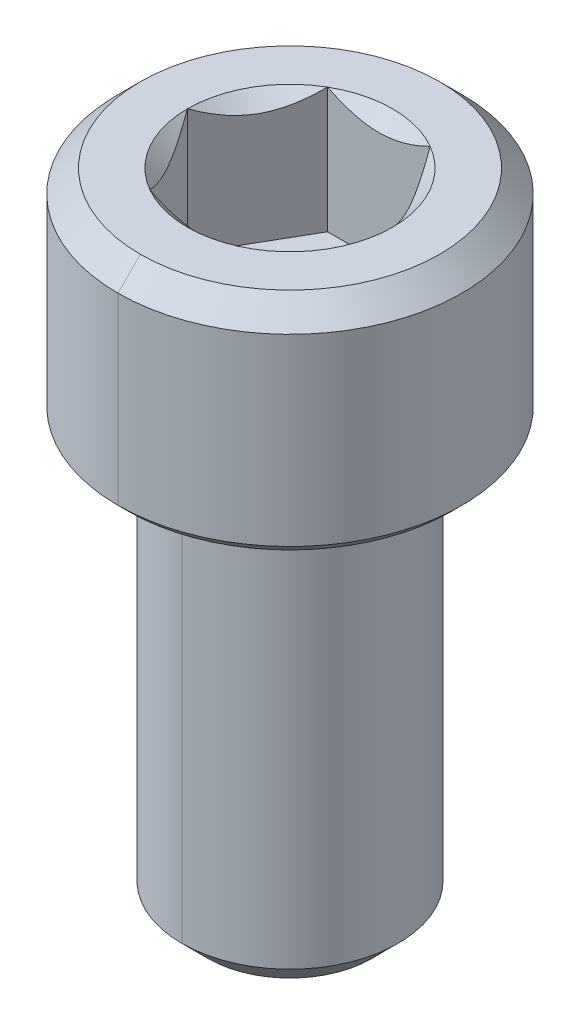
ISO-10303-21;
HEADER;
FILE_DESCRIPTION(('STEP AP214'),'2;1');
FILE_NAME('part.step','',(''),(''),'','','');
FILE_SCHEMA(('AUTOMOTIVE_DESIGN { 1 0 10303 214 1 1 1 1 }'));
ENDSEC;
DATA;
#1=APPLICATION_CONTEXT('core data for automotive mechanical design processes');
#2=APPLICATION_PROTOCOL_DEFINITION('international standard','automotive_design',2000,#1);
#3=PRODUCT_CONTEXT('',#1,'mechanical');
#4=PRODUCT('Part','Part','',(#3));
#5=PRODUCT_RELATED_PRODUCT_CATEGORY('part','',(#4));
#6=PRODUCT_DEFINITION_FORMATION('','',#4);
#7=PRODUCT_DEFINITION_CONTEXT('part definition',#1,'design');
#8=PRODUCT_DEFINITION('design','',#6,#7);
#9=PRODUCT_DEFINITION_SHAPE('','',#8);
#10=(LENGTH_UNIT() NAMED_UNIT(*) SI_UNIT(.MILLI.,.METRE.));
#11=(NAMED_UNIT(*) PLANE_ANGLE_UNIT() SI_UNIT($,.RADIAN.));
#12=(NAMED_UNIT(*) SI_UNIT($,.STERADIAN.) SOLID_ANGLE_UNIT());
#13=UNCERTAINTY_MEASURE_WITH_UNIT(LENGTH_MEASURE(1.E-05),#10,'distance_accuracy_value','');
#14=(GEOMETRIC_REPRESENTATION_CONTEXT(3) GLOBAL_UNCERTAINTY_ASSIGNED_CONTEXT((#13)) GLOBAL_UNIT_ASSIGNED_CONTEXT((#10,
#11,#12)) REPRESENTATION_CONTEXT('',''));
#15=CARTESIAN_POINT('',(0.,0.,0.));
#16=DIRECTION('',(0.,0.,1.));
#17=DIRECTION('',(1.,0.,0.));
#18=AXIS2_PLACEMENT_3D('',#15,#16,#17);
#19=CARTESIAN_POINT('',(0.,-0.1524,0.));
#20=DIRECTION('',(0.,1.,0.));
#21=DIRECTION('',(0.,0.,1.));
#22=AXIS2_PLACEMENT_3D('',#19,#20,#21);
#23=TOROIDAL_SURFACE('',#22,2.5654,0.1524);
#24=CARTESIAN_POINT('',(0.,-0.1524,-2.5654));
#25=DIRECTION('',(1.,0.,0.));
#26=DIRECTION('',(0.,0.,-1.));
#27=AXIS2_PLACEMENT_3D('',#24,#25,#26);
#28=CIRCLE('',#27,0.1524);
#29=CARTESIAN_POINT('',(0.,0.,-2.5654));
#30=VERTEX_POINT('',#29);
#31=CARTESIAN_POINT('',(0.,-0.1524,-2.413));
#32=VERTEX_POINT('',#31);
#33=EDGE_CURVE('E215',#30,#32,#28,.T.);
#34=ORIENTED_EDGE('',*,*,#33,.F.);
#35=CARTESIAN_POINT('',(0.,0.,0.));
#36=DIRECTION('',(0.,1.,0.));
#37=DIRECTION('',(0.,0.,1.));
#38=AXIS2_PLACEMENT_3D('',#35,#36,#37);
#39=CIRCLE('',#38,2.5654);
#40=CARTESIAN_POINT('',(0.,0.,2.5654));
#41=VERTEX_POINT('',#40);
#42=EDGE_CURVE('E428',#41,#30,#39,.T.);
#43=ORIENTED_EDGE('',*,*,#42,.F.);
#44=CARTESIAN_POINT('',(0.,-0.1524,2.5654));
#45=DIRECTION('',(-1.,0.,0.));
#46=DIRECTION('',(0.,0.,1.));
#47=AXIS2_PLACEMENT_3D('',#44,#45,#46);
#48=CIRCLE('',#47,0.1524);
#49=CARTESIAN_POINT('',(0.,-0.1524,2.413));
#50=VERTEX_POINT('',#49);
#51=EDGE_CURVE('E214',#41,#50,#48,.T.);
#52=ORIENTED_EDGE('',*,*,#51,.T.);
#53=CARTESIAN_POINT('',(0.,-0.1524,0.));
#54=DIRECTION('',(0.,-1.,0.));
#55=DIRECTION('',(0.,0.,1.));
#56=AXIS2_PLACEMENT_3D('',#53,#54,#55);
#57=CIRCLE('',#56,2.413);
#58=EDGE_CURVE('E185',#32,#50,#57,.T.);
#59=ORIENTED_EDGE('',*,*,#58,.F.);
#60=EDGE_LOOP('',(#34,#43,#52,#59));
#61=FACE_BOUND('',#60,.T.);
#62=ADVANCED_FACE('F16',(#61),#23,.F.);
#63=CARTESIAN_POINT('',(2.28769270663697,2.032,0.));
#64=DIRECTION('',(0.866025403784439,0.,-0.5));
#65=DIRECTION('',(0.,-1.,0.));
#66=AXIS2_PLACEMENT_3D('',#63,#64,#65);
#67=PLANE('',#66);
#68=DIRECTION('',(0.,1.,0.));
#69=VECTOR('',#68,1.);
#70=CARTESIAN_POINT('',(2.28769270663697,2.032,0.));
#71=LINE('',#70,#69);
#72=CARTESIAN_POINT('',(2.28769270663697,2.032,0.));
#73=VERTEX_POINT('',#72);
#74=CARTESIAN_POINT('',(2.28769270663697,4.826,0.));
#75=VERTEX_POINT('',#74);
#76=EDGE_CURVE('E11',#73,#75,#71,.T.);
#77=ORIENTED_EDGE('',*,*,#76,.T.);
#78=CARTESIAN_POINT('',(2.28769270663697,4.826,0.));
#79=CARTESIAN_POINT('',(2.14317957440595,4.68148686776898,-0.250304087385059));
#80=CARTESIAN_POINT('',(2.01227876614631,4.6063557329633,-0.477030938042588));
#81=CARTESIAN_POINT('',(1.86218187125153,4.52020691391333,-0.737006386058674));
#82=CARTESIAN_POINT('',(1.71787595811445,4.51951177250135,-0.986951559444716));
#83=CARTESIAN_POINT('',(1.5738329827954,4.51881789769698,-1.23644131117069));
#84=CARTESIAN_POINT('',(1.42308868167617,4.6041731544126,-1.49753809966066));
#85=CARTESIAN_POINT('',(1.29072619033411,4.67912016298365,-1.7267966596815));
#86=CARTESIAN_POINT('',(1.14384635331849,4.826,-1.9812));
#87=B_SPLINE_CURVE_WITH_KNOTS('',2,(#78,#79,#80,#81,#82,#83,#84,#85,#86),.UNSPECIFIED.,.F.,.F.,
(3,2,2,2,3),(0.,0.25,0.5,0.75,1.),.UNSPECIFIED.);
#88=CARTESIAN_POINT('',(1.14384635331849,4.826,-1.9812));
#89=VERTEX_POINT('',#88);
#90=EDGE_CURVE('E248',#75,#89,#87,.T.);
#91=ORIENTED_EDGE('',*,*,#90,.T.);
#92=DIRECTION('',(0.,1.,0.));
#93=VECTOR('',#92,1.);
#94=CARTESIAN_POINT('',(1.14384635331849,2.032,-1.9812));
#95=LINE('',#94,#93);
#96=CARTESIAN_POINT('',(1.14384635331849,2.032,-1.9812));
#97=VERTEX_POINT('',#96);
#98=EDGE_CURVE('E225',#97,#89,#95,.T.);
#99=ORIENTED_EDGE('',*,*,#98,.F.);
#100=DIRECTION('',(-0.5,0.,-0.866025403784439));
#101=VECTOR('',#100,1.);
#102=CARTESIAN_POINT('',(2.28769270663697,2.032,0.));
#103=LINE('',#102,#101);
#104=EDGE_CURVE('E212',#73,#97,#103,.T.);
#105=ORIENTED_EDGE('',*,*,#104,.F.);
#106=EDGE_LOOP('',(#77,#91,#99,#105));
#107=FACE_BOUND('',#106,.T.);
#108=ADVANCED_FACE('F255',(#107),#67,.F.);
#109=CARTESIAN_POINT('',(1.14384635331849,2.032,1.9812));
#110=DIRECTION('',(0.866025403784439,0.,0.5));
#111=DIRECTION('',(0.,-1.,0.));
#112=AXIS2_PLACEMENT_3D('',#109,#110,#111);
#113=PLANE('',#112);
#114=DIRECTION('',(0.,1.,0.));
#115=VECTOR('',#114,1.);
#116=CARTESIAN_POINT('',(1.14384635331849,2.032,1.9812));
#117=LINE('',#116,#115);
#118=CARTESIAN_POINT('',(1.14384635331849,2.032,1.9812));
#119=VERTEX_POINT('',#118);
#120=CARTESIAN_POINT('',(1.14384635331849,4.826,1.9812));
#121=VERTEX_POINT('',#120);
#122=EDGE_CURVE('E30',#119,#121,#117,.T.);
#123=ORIENTED_EDGE('',*,*,#122,.T.);
#124=CARTESIAN_POINT('',(1.14384635331849,4.826,1.9812));
#125=CARTESIAN_POINT('',(1.28835948554838,4.6814868677701,1.7308959126169));
#126=CARTESIAN_POINT('',(1.41926029380915,4.60635573296329,1.50416906195741));
#127=CARTESIAN_POINT('',(1.56935718870215,4.5202069139138,1.24419361394442));
#128=CARTESIAN_POINT('',(1.71366310184101,4.51951177250135,0.994248440555283));
#129=CARTESIAN_POINT('',(1.85770607715928,4.51881789769651,0.744758688830662));
#130=CARTESIAN_POINT('',(2.00845037827929,4.6041731544126,0.48366190033934));
#131=CARTESIAN_POINT('',(2.14081286962138,4.67912016298368,0.254403340318435));
#132=CARTESIAN_POINT('',(2.28769270663697,4.826,0.));
#133=B_SPLINE_CURVE_WITH_KNOTS('',2,(#124,#125,#126,#127,#128,#129,#130,#131,#132),
.UNSPECIFIED.,.F.,.F.,(3,2,2,2,3),(0.,0.25,0.5,0.75,1.),.UNSPECIFIED.);
#134=EDGE_CURVE('E321',#121,#75,#133,.T.);
#135=ORIENTED_EDGE('',*,*,#134,.T.);
#136=ORIENTED_EDGE('',*,*,#76,.F.);
#137=DIRECTION('',(0.5,0.,-0.866025403784439));
#138=VECTOR('',#137,1.);
#139=CARTESIAN_POINT('',(1.14384635331849,2.032,1.9812));
#140=LINE('',#139,#138);
#141=EDGE_CURVE('E222',#119,#73,#140,.T.);
#142=ORIENTED_EDGE('',*,*,#141,.F.);
#143=EDGE_LOOP('',(#123,#135,#136,#142));
#144=FACE_BOUND('',#143,.T.);
#145=ADVANCED_FACE('F265',(#144),#113,.F.);
#146=CARTESIAN_POINT('',(-1.14384635331848,2.032,1.9812));
#147=DIRECTION('',(0.,0.,1.));
#148=DIRECTION('',(1.,0.,0.));
#149=AXIS2_PLACEMENT_3D('',#146,#147,#148);
#150=PLANE('',#149);
#151=DIRECTION('',(0.,1.,0.));
#152=VECTOR('',#151,1.);
#153=CARTESIAN_POINT('',(-1.14384635331848,2.032,1.9812));
#154=LINE('',#153,#152);
#155=CARTESIAN_POINT('',(-1.14384635331848,2.032,1.9812));
#156=VERTEX_POINT('',#155);
#157=CARTESIAN_POINT('',(-1.14384635331848,4.826,1.9812));
#158=VERTEX_POINT('',#157);
#159=EDGE_CURVE('E572',#156,#158,#154,.T.);
#160=ORIENTED_EDGE('',*,*,#159,.T.);
#161=CARTESIAN_POINT('',(-1.14384635331848,4.826,1.9812));
#162=CARTESIAN_POINT('',(-0.852604529161856,4.68037908792168,1.9812));
#163=CARTESIAN_POINT('',(-0.58892975472875,4.6051869937822,1.9812));
#164=CARTESIAN_POINT('',(-0.288478278545423,4.51950729336303,1.9812));
#165=CARTESIAN_POINT('',(0.,4.51950729336303,1.9812));
#166=B_SPLINE_CURVE_WITH_KNOTS('',2,(#161,#162,#163,#164,#165),.UNSPECIFIED.,.F.,.F.,(3,2,3),
(0.,0.5,1.),.UNSPECIFIED.);
#167=CARTESIAN_POINT('',(0.,4.51950729336303,1.9812));
#168=VERTEX_POINT('',#167);
#169=EDGE_CURVE('E579',#158,#168,#166,.T.);
#170=ORIENTED_EDGE('',*,*,#169,.T.);
#171=CARTESIAN_POINT('',(0.,4.51950729336303,1.9812));
#172=CARTESIAN_POINT('',(0.287946815411568,4.51950729336303,1.9812));
#173=CARTESIAN_POINT('',(0.588849780232636,4.60516420753973,1.9812));
#174=CARTESIAN_POINT('',(0.851987770474281,4.68007070857789,1.9812));
#175=CARTESIAN_POINT('',(1.14384635331849,4.826,1.9812));
#176=B_SPLINE_CURVE_WITH_KNOTS('',2,(#171,#172,#173,#174,#175),.UNSPECIFIED.,.F.,.F.,(3,2,3),
(0.,0.5,1.),.UNSPECIFIED.);
#177=EDGE_CURVE('E501',#168,#121,#176,.T.);
#178=ORIENTED_EDGE('',*,*,#177,.T.);
#179=ORIENTED_EDGE('',*,*,#122,.F.);
#180=DIRECTION('',(1.,0.,0.));
#181=VECTOR('',#180,1.);
#182=CARTESIAN_POINT('',(-1.14384635331848,2.032,1.9812));
#183=LINE('',#182,#181);
#184=EDGE_CURVE('E221',#156,#119,#183,.T.);
#185=ORIENTED_EDGE('',*,*,#184,.F.);
#186=EDGE_LOOP('',(#160,#170,#178,#179,#185));
#187=FACE_BOUND('',#186,.T.);
#188=ADVANCED_FACE('F279',(#187),#150,.F.);
#189=CARTESIAN_POINT('',(-2.28769270663697,2.032,0.));
#190=DIRECTION('',(-0.866025403784438,0.,0.5));
#191=DIRECTION('',(0.,1.,0.));
#192=AXIS2_PLACEMENT_3D('',#189,#190,#191);
#193=PLANE('',#192);
#194=DIRECTION('',(0.,1.,0.));
#195=VECTOR('',#194,1.);
#196=CARTESIAN_POINT('',(-2.28769270663697,2.032,0.));
#197=LINE('',#196,#195);
#198=CARTESIAN_POINT('',(-2.28769270663697,2.032,0.));
#199=VERTEX_POINT('',#198);
#200=CARTESIAN_POINT('',(-2.28769270663697,4.826,0.));
#201=VERTEX_POINT('',#200);
#202=EDGE_CURVE('E358',#199,#201,#197,.T.);
#203=ORIENTED_EDGE('',*,*,#202,.T.);
#204=CARTESIAN_POINT('',(-2.28769270663697,4.826,0.));
#205=CARTESIAN_POINT('',(-2.14317957440604,4.68148686776907,0.250304087384906));
#206=CARTESIAN_POINT('',(-2.01227876614631,4.6063557329633,0.477030938042588));
#207=CARTESIAN_POINT('',(-1.8621818712512,4.5202069139131,0.737006386059238));
#208=CARTESIAN_POINT('',(-1.71787595811445,4.51951177250135,0.986951559444715));
#209=CARTESIAN_POINT('',(-1.57383298279637,4.51881789769721,1.23644131116902));
#210=CARTESIAN_POINT('',(-1.42308868167617,4.6041731544126,1.49753809966066));
#211=CARTESIAN_POINT('',(-1.2907261903357,4.67912016298207,1.72679665967875));
#212=CARTESIAN_POINT('',(-1.14384635331849,4.826,1.9812));
#213=B_SPLINE_CURVE_WITH_KNOTS('',2,(#204,#205,#206,#207,#208,#209,#210,#211,#212),
.UNSPECIFIED.,.F.,.F.,(3,2,2,2,3),(0.,0.25,0.5,0.75,1.),.UNSPECIFIED.);
#214=EDGE_CURVE('E541',#201,#158,#213,.T.);
#215=ORIENTED_EDGE('',*,*,#214,.T.);
#216=ORIENTED_EDGE('',*,*,#159,.F.);
#217=DIRECTION('',(0.5,0.,0.866025403784439));
#218=VECTOR('',#217,1.);
#219=CARTESIAN_POINT('',(-2.28769270663697,2.032,0.));
#220=LINE('',#219,#218);
#221=EDGE_CURVE('E217',#199,#156,#220,.T.);
#222=ORIENTED_EDGE('',*,*,#221,.F.);
#223=EDGE_LOOP('',(#203,#215,#216,#222));
#224=FACE_BOUND('',#223,.T.);
#225=ADVANCED_FACE('F521',(#224),#193,.F.);
#226=CARTESIAN_POINT('',(-1.14384635331849,2.032,-1.9812));
#227=DIRECTION('',(-0.866025403784439,0.,-0.5));
#228=DIRECTION('',(-0.5,0.,0.866025403784439));
#229=AXIS2_PLACEMENT_3D('',#226,#227,#228);
#230=PLANE('',#229);
#231=DIRECTION('',(0.,1.,0.));
#232=VECTOR('',#231,1.);
#233=CARTESIAN_POINT('',(-1.14384635331849,2.032,-1.9812));
#234=LINE('',#233,#232);
#235=CARTESIAN_POINT('',(-1.14384635331849,2.032,-1.9812));
#236=VERTEX_POINT('',#235);
#237=CARTESIAN_POINT('',(-1.14384635331849,4.826,-1.9812));
#238=VERTEX_POINT('',#237);
#239=EDGE_CURVE('E308',#236,#238,#234,.T.);
#240=ORIENTED_EDGE('',*,*,#239,.T.);
#241=CARTESIAN_POINT('',(-1.14384635331849,4.826,-1.9812));
#242=CARTESIAN_POINT('',(-1.28835948554886,4.68148686776963,-1.73089591261607));
#243=CARTESIAN_POINT('',(-1.41926029380915,4.6063557329633,-1.50416906195741));
#244=CARTESIAN_POINT('',(-1.56935718870378,4.5202069139131,-1.24419361394159));
#245=CARTESIAN_POINT('',(-1.71366310184101,4.51951177250136,-0.994248440555283));
#246=CARTESIAN_POINT('',(-1.85770607715962,4.51881789769721,-0.744758688830066));
#247=CARTESIAN_POINT('',(-2.00845037827929,4.6041731544126,-0.48366190033934));
#248=CARTESIAN_POINT('',(-2.14081286962037,4.67912016298268,-0.254403340320189));
#249=CARTESIAN_POINT('',(-2.28769270663697,4.826,0.));
#250=B_SPLINE_CURVE_WITH_KNOTS('',2,(#241,#242,#243,#244,#245,#246,#247,#248,#249),
.UNSPECIFIED.,.F.,.F.,(3,2,2,2,3),(0.,0.25,0.5,0.75,1.),.UNSPECIFIED.);
#251=EDGE_CURVE('E650',#238,#201,#250,.T.);
#252=ORIENTED_EDGE('',*,*,#251,.T.);
#253=ORIENTED_EDGE('',*,*,#202,.F.);
#254=DIRECTION('',(-0.5,0.,0.866025403784439));
#255=VECTOR('',#254,1.);
#256=CARTESIAN_POINT('',(-1.14384635331849,2.032,-1.9812));
#257=LINE('',#256,#255);
#258=EDGE_CURVE('E211',#236,#199,#257,.T.);
#259=ORIENTED_EDGE('',*,*,#258,.F.);
#260=EDGE_LOOP('',(#240,#252,#253,#259));
#261=FACE_BOUND('',#260,.T.);
#262=ADVANCED_FACE('F18',(#261),#230,.F.);
#263=CARTESIAN_POINT('',(1.14384635331849,2.032,-1.9812));
#264=DIRECTION('',(0.,0.,-1.));
#265=DIRECTION('',(0.,-1.,0.));
#266=AXIS2_PLACEMENT_3D('',#263,#264,#265);
#267=PLANE('',#266);
#268=ORIENTED_EDGE('',*,*,#98,.T.);
#269=CARTESIAN_POINT('',(1.14384635331849,4.826,-1.9812));
#270=CARTESIAN_POINT('',(0.852681268449242,4.68041745756538,-1.9812));
#271=CARTESIAN_POINT('',(0.589071853179802,4.60522748732522,-1.9812));
#272=CARTESIAN_POINT('',(0.289065178881829,4.51965583621686,-1.9812));
#273=CARTESIAN_POINT('',(0.000466056341207922,4.51950734818044,-1.9812));
#274=CARTESIAN_POINT('',(-0.28735920168427,4.51935925830747,-1.9812));
#275=CARTESIAN_POINT('',(-0.588708500274589,4.60512396116295,-1.9812));
#276=CARTESIAN_POINT('',(-0.851909486810259,4.68003156674588,-1.9812));
#277=CARTESIAN_POINT('',(-1.14384635331849,4.826,-1.9812));
#278=B_SPLINE_CURVE_WITH_KNOTS('',2,(#269,#270,#271,#272,#273,#274,#275,#276,#277),
.UNSPECIFIED.,.F.,.F.,(3,2,2,2,3),(0.,0.25,0.5,0.75,1.),.UNSPECIFIED.);
#279=EDGE_CURVE('E365',#89,#238,#278,.T.);
#280=ORIENTED_EDGE('',*,*,#279,.T.);
#281=ORIENTED_EDGE('',*,*,#239,.F.);
#282=DIRECTION('',(-1.,0.,0.));
#283=VECTOR('',#282,1.);
#284=CARTESIAN_POINT('',(1.14384635331849,2.032,-1.9812));
#285=LINE('',#284,#283);
#286=EDGE_CURVE('E207',#97,#236,#285,.T.);
#287=ORIENTED_EDGE('',*,*,#286,.F.);
#288=EDGE_LOOP('',(#268,#280,#281,#287));
#289=FACE_BOUND('',#288,.T.);
#290=ADVANCED_FACE('F371',(#289),#267,.F.);
#291=CARTESIAN_POINT('',(0.,2.032,0.));
#292=DIRECTION('',(0.,1.,0.));
#293=DIRECTION('',(1.,0.,0.));
#294=AXIS2_PLACEMENT_3D('',#291,#292,#293);
#295=PLANE('',#294);
#296=ORIENTED_EDGE('',*,*,#104,.T.);
#297=ORIENTED_EDGE('',*,*,#286,.T.);
#298=ORIENTED_EDGE('',*,*,#258,.T.);
#299=ORIENTED_EDGE('',*,*,#221,.T.);
#300=ORIENTED_EDGE('',*,*,#184,.T.);
#301=ORIENTED_EDGE('',*,*,#141,.T.);
#302=EDGE_LOOP('',(#296,#297,#298,#299,#300,#301));
#303=FACE_BOUND('',#302,.T.);
#304=ADVANCED_FACE('F277',(#303),#295,.T.);
#305=CARTESIAN_POINT('',(0.,4.826,0.));
#306=DIRECTION('',(0.,1.,0.));
#307=DIRECTION('',(0.,0.,1.));
#308=AXIS2_PLACEMENT_3D('',#305,#306,#307);
#309=CONICAL_SURFACE('',#308,2.28769270663697,0.78539816339745);
#310=CARTESIAN_POINT('',(0.,4.826,0.));
#311=DIRECTION('',(0.,1.,0.));
#312=DIRECTION('',(0.,0.,1.));
#313=AXIS2_PLACEMENT_3D('',#310,#311,#312);
#314=CIRCLE('',#313,2.28769270663697);
#315=EDGE_CURVE('E292',#75,#89,#314,.T.);
#316=ORIENTED_EDGE('',*,*,#315,.T.);
#317=ORIENTED_EDGE('',*,*,#90,.F.);
#318=EDGE_LOOP('',(#316,#317));
#319=FACE_BOUND('',#318,.T.);
#320=ADVANCED_FACE('F272',(#319),#309,.F.);
#321=CARTESIAN_POINT('',(0.,4.826,0.));
#322=DIRECTION('',(0.,1.,0.));
#323=DIRECTION('',(0.,0.,1.));
#324=AXIS2_PLACEMENT_3D('',#321,#322,#323);
#325=CONICAL_SURFACE('',#324,2.28769270663697,0.78539816339745);
#326=CARTESIAN_POINT('',(0.,4.826,0.));
#327=DIRECTION('',(0.,1.,0.));
#328=DIRECTION('',(0.,0.,1.));
#329=AXIS2_PLACEMENT_3D('',#326,#327,#328);
#330=CIRCLE('',#329,2.28769270663697);
#331=EDGE_CURVE('E241',#121,#75,#330,.T.);
#332=ORIENTED_EDGE('',*,*,#331,.T.);
#333=ORIENTED_EDGE('',*,*,#134,.F.);
#334=EDGE_LOOP('',(#332,#333));
#335=FACE_BOUND('',#334,.T.);
#336=ADVANCED_FACE('F276',(#335),#325,.F.);
#337=CARTESIAN_POINT('',(0.,4.826,0.));
#338=DIRECTION('',(0.,1.,0.));
#339=DIRECTION('',(0.,0.,1.));
#340=AXIS2_PLACEMENT_3D('',#337,#338,#339);
#341=CONICAL_SURFACE('',#340,2.28769270663697,0.78539816339745);
#342=DIRECTION('',(0.,0.707106781186546,0.707106781186549));
#343=VECTOR('',#342,1.);
#344=CARTESIAN_POINT('',(0.,4.826,2.28769270663697));
#345=LINE('',#344,#343);
#346=CARTESIAN_POINT('',(0.,4.826,2.28769270663697));
#347=VERTEX_POINT('',#346);
#348=EDGE_CURVE('E453',#168,#347,#345,.T.);
#349=ORIENTED_EDGE('',*,*,#348,.F.);
#350=ORIENTED_EDGE('',*,*,#169,.F.);
#351=CARTESIAN_POINT('',(0.,4.826,0.));
#352=DIRECTION('',(0.,1.,0.));
#353=DIRECTION('',(0.,0.,1.));
#354=AXIS2_PLACEMENT_3D('',#351,#352,#353);
#355=CIRCLE('',#354,2.28769270663697);
#356=EDGE_CURVE('E303',#158,#347,#355,.T.);
#357=ORIENTED_EDGE('',*,*,#356,.T.);
#358=EDGE_LOOP('',(#349,#350,#357));
#359=FACE_BOUND('',#358,.T.);
#360=ADVANCED_FACE('F266',(#359),#341,.F.);
#361=CARTESIAN_POINT('',(0.,4.826,0.));
#362=DIRECTION('',(0.,1.,0.));
#363=DIRECTION('',(0.,0.,1.));
#364=AXIS2_PLACEMENT_3D('',#361,#362,#363);
#365=CONICAL_SURFACE('',#364,2.28769270663697,0.78539816339745);
#366=CARTESIAN_POINT('',(0.,4.826,0.));
#367=DIRECTION('',(0.,1.,0.));
#368=DIRECTION('',(0.,0.,1.));
#369=AXIS2_PLACEMENT_3D('',#366,#367,#368);
#370=CIRCLE('',#369,2.28769270663697);
#371=EDGE_CURVE('E603',#201,#158,#370,.T.);
#372=ORIENTED_EDGE('',*,*,#371,.T.);
#373=ORIENTED_EDGE('',*,*,#214,.F.);
#374=EDGE_LOOP('',(#372,#373));
#375=FACE_BOUND('',#374,.T.);
#376=ADVANCED_FACE('F342',(#375),#365,.F.);
#377=CARTESIAN_POINT('',(0.,4.826,0.));
#378=DIRECTION('',(0.,1.,0.));
#379=DIRECTION('',(0.,0.,1.));
#380=AXIS2_PLACEMENT_3D('',#377,#378,#379);
#381=CONICAL_SURFACE('',#380,2.28769270663697,0.78539816339745);
#382=CARTESIAN_POINT('',(0.,4.826,0.));
#383=DIRECTION('',(0.,1.,0.));
#384=DIRECTION('',(0.,0.,1.));
#385=AXIS2_PLACEMENT_3D('',#382,#383,#384);
#386=CIRCLE('',#385,2.28769270663697);
#387=EDGE_CURVE('E314',#238,#201,#386,.T.);
#388=ORIENTED_EDGE('',*,*,#387,.T.);
#389=ORIENTED_EDGE('',*,*,#251,.F.);
#390=EDGE_LOOP('',(#388,#389));
#391=FACE_BOUND('',#390,.T.);
#392=ADVANCED_FACE('F338',(#391),#381,.F.);
#393=CARTESIAN_POINT('',(0.,4.826,0.));
#394=DIRECTION('',(0.,1.,0.));
#395=DIRECTION('',(0.,0.,1.));
#396=AXIS2_PLACEMENT_3D('',#393,#394,#395);
#397=CONICAL_SURFACE('',#396,2.28769270663697,0.78539816339745);
#398=CARTESIAN_POINT('',(0.,4.826,0.));
#399=DIRECTION('',(0.,1.,0.));
#400=DIRECTION('',(0.,0.,1.));
#401=AXIS2_PLACEMENT_3D('',#398,#399,#400);
#402=CIRCLE('',#401,2.28769270663697);
#403=EDGE_CURVE('E297',#89,#238,#402,.T.);
#404=ORIENTED_EDGE('',*,*,#403,.T.);
#405=ORIENTED_EDGE('',*,*,#279,.F.);
#406=EDGE_LOOP('',(#404,#405));
#407=FACE_BOUND('',#406,.T.);
#408=ADVANCED_FACE('F341',(#407),#397,.F.);
#409=CARTESIAN_POINT('',(0.,0.2286,0.));
#410=DIRECTION('',(0.,1.,0.));
#411=DIRECTION('',(0.,0.,1.));
#412=AXIS2_PLACEMENT_3D('',#409,#410,#411);
#413=CONICAL_SURFACE('',#412,3.8354,0.785398163397451);
#414=DIRECTION('',(0.,0.707106781186546,-0.70710678118655));
#415=VECTOR('',#414,1.);
#416=CARTESIAN_POINT('',(0.,0.2286,-3.8354));
#417=LINE('',#416,#415);
#418=CARTESIAN_POINT('',(0.,0.,-3.6068));
#419=VERTEX_POINT('',#418);
#420=CARTESIAN_POINT('',(0.,0.2286,-3.8354));
#421=VERTEX_POINT('',#420);
#422=EDGE_CURVE('E439',#419,#421,#417,.T.);
#423=ORIENTED_EDGE('',*,*,#422,.F.);
#424=CARTESIAN_POINT('',(0.,0.,0.));
#425=DIRECTION('',(0.,-1.,0.));
#426=DIRECTION('',(0.,0.,1.));
#427=AXIS2_PLACEMENT_3D('',#424,#425,#426);
#428=CIRCLE('',#427,3.6068);
#429=CARTESIAN_POINT('',(0.,0.,3.6068));
#430=VERTEX_POINT('',#429);
#431=EDGE_CURVE('E296',#430,#419,#428,.T.);
#432=ORIENTED_EDGE('',*,*,#431,.F.);
#433=DIRECTION('',(0.,0.707106781186546,0.70710678118655));
#434=VECTOR('',#433,1.);
#435=CARTESIAN_POINT('',(0.,0.2286,3.8354));
#436=LINE('',#435,#434);
#437=CARTESIAN_POINT('',(0.,0.2286,3.8354));
#438=VERTEX_POINT('',#437);
#439=EDGE_CURVE('E445',#430,#438,#436,.T.);
#440=ORIENTED_EDGE('',*,*,#439,.T.);
#441=CARTESIAN_POINT('',(0.,0.2286,0.));
#442=DIRECTION('',(0.,1.,0.));
#443=DIRECTION('',(0.,0.,1.));
#444=AXIS2_PLACEMENT_3D('',#441,#442,#443);
#445=CIRCLE('',#444,3.8354);
#446=EDGE_CURVE('E227',#421,#438,#445,.T.);
#447=ORIENTED_EDGE('',*,*,#446,.F.);
#448=EDGE_LOOP('',(#423,#432,#440,#447));
#449=FACE_BOUND('',#448,.T.);
#450=ADVANCED_FACE('F383',(#449),#413,.T.);
#451=CARTESIAN_POINT('',(0.,4.826,0.));
#452=DIRECTION('',(0.,-1.,0.));
#453=DIRECTION('',(0.,0.,-1.));
#454=AXIS2_PLACEMENT_3D('',#451,#452,#453);
#455=CONICAL_SURFACE('',#454,3.3354,0.785398163397445);
#456=DIRECTION('',(0.,-0.70710678118655,0.707106781186546));
#457=VECTOR('',#456,1.);
#458=CARTESIAN_POINT('',(0.,4.826,3.3354));
#459=LINE('',#458,#457);
#460=CARTESIAN_POINT('',(0.,4.826,3.3354));
#461=VERTEX_POINT('',#460);
#462=CARTESIAN_POINT('',(0.,4.326,3.8354));
#463=VERTEX_POINT('',#462);
#464=EDGE_CURVE('E491',#461,#463,#459,.T.);
#465=ORIENTED_EDGE('',*,*,#464,.F.);
#466=CARTESIAN_POINT('',(0.,4.826,0.));
#467=DIRECTION('',(0.,1.,0.));
#468=DIRECTION('',(0.,0.,1.));
#469=AXIS2_PLACEMENT_3D('',#466,#467,#468);
#470=CIRCLE('',#469,3.3354);
#471=CARTESIAN_POINT('',(0.,4.826,-3.3354));
#472=VERTEX_POINT('',#471);
#473=EDGE_CURVE('E230',#472,#461,#470,.T.);
#474=ORIENTED_EDGE('',*,*,#473,.F.);
#475=DIRECTION('',(0.,-0.70710678118655,-0.707106781186546));
#476=VECTOR('',#475,1.);
#477=CARTESIAN_POINT('',(0.,4.826,-3.3354));
#478=LINE('',#477,#476);
#479=CARTESIAN_POINT('',(0.,4.326,-3.8354));
#480=VERTEX_POINT('',#479);
#481=EDGE_CURVE('E237',#472,#480,#478,.T.);
#482=ORIENTED_EDGE('',*,*,#481,.T.);
#483=CARTESIAN_POINT('',(0.,4.326,0.));
#484=DIRECTION('',(0.,-1.,0.));
#485=DIRECTION('',(0.,0.,1.));
#486=AXIS2_PLACEMENT_3D('',#483,#484,#485);
#487=CIRCLE('',#486,3.8354);
#488=EDGE_CURVE('E231',#463,#480,#487,.T.);
#489=ORIENTED_EDGE('',*,*,#488,.F.);
#490=EDGE_LOOP('',(#465,#474,#482,#489));
#491=FACE_BOUND('',#490,.T.);
#492=ADVANCED_FACE('F386',(#491),#455,.T.);
#493=CARTESIAN_POINT('',(0.,0.,0.));
#494=DIRECTION('',(0.,1.,0.));
#495=DIRECTION('',(1.,0.,0.));
#496=AXIS2_PLACEMENT_3D('',#493,#494,#495);
#497=PLANE('',#496);
#498=ORIENTED_EDGE('',*,*,#42,.T.);
#499=CARTESIAN_POINT('',(0.,0.,0.));
#500=DIRECTION('',(0.,1.,0.));
#501=DIRECTION('',(0.,0.,1.));
#502=AXIS2_PLACEMENT_3D('',#499,#500,#501);
#503=CIRCLE('',#502,2.5654);
#504=EDGE_CURVE('E466',#30,#41,#503,.T.);
#505=ORIENTED_EDGE('',*,*,#504,.T.);
#506=EDGE_LOOP('',(#498,#505));
#507=FACE_BOUND('',#506,.T.);
#508=ORIENTED_EDGE('',*,*,#431,.T.);
#509=CARTESIAN_POINT('',(0.,0.,0.));
#510=DIRECTION('',(0.,-1.,0.));
#511=DIRECTION('',(0.,0.,1.));
#512=AXIS2_PLACEMENT_3D('',#509,#510,#511);
#513=CIRCLE('',#512,3.6068);
#514=EDGE_CURVE('E433',#419,#430,#513,.T.);
#515=ORIENTED_EDGE('',*,*,#514,.T.);
#516=EDGE_LOOP('',(#508,#515));
#517=FACE_BOUND('',#516,.T.);
#518=ADVANCED_FACE('F414',(#507,#517),#497,.F.);
#519=CARTESIAN_POINT('',(0.,4.826,0.));
#520=DIRECTION('',(0.,1.,0.));
#521=DIRECTION('',(1.,0.,0.));
#522=AXIS2_PLACEMENT_3D('',#519,#520,#521);
#523=PLANE('',#522);
#524=ORIENTED_EDGE('',*,*,#331,.F.);
#525=CARTESIAN_POINT('',(0.,4.826,0.));
#526=DIRECTION('',(0.,1.,0.));
#527=DIRECTION('',(0.,0.,1.));
#528=AXIS2_PLACEMENT_3D('',#525,#526,#527);
#529=CIRCLE('',#528,2.28769270663697);
#530=EDGE_CURVE('E447',#347,#121,#529,.T.);
#531=ORIENTED_EDGE('',*,*,#530,.F.);
#532=ORIENTED_EDGE('',*,*,#356,.F.);
#533=ORIENTED_EDGE('',*,*,#371,.F.);
#534=ORIENTED_EDGE('',*,*,#387,.F.);
#535=ORIENTED_EDGE('',*,*,#403,.F.);
#536=ORIENTED_EDGE('',*,*,#315,.F.);
#537=EDGE_LOOP('',(#524,#531,#532,#533,#534,#535,#536));
#538=FACE_BOUND('',#537,.T.);
#539=ORIENTED_EDGE('',*,*,#473,.T.);
#540=CARTESIAN_POINT('',(0.,4.826,0.));
#541=DIRECTION('',(0.,1.,0.));
#542=DIRECTION('',(0.,0.,1.));
#543=AXIS2_PLACEMENT_3D('',#540,#541,#542);
#544=CIRCLE('',#543,3.3354);
#545=EDGE_CURVE('E482',#461,#472,#544,.T.);
#546=ORIENTED_EDGE('',*,*,#545,.T.);
#547=EDGE_LOOP('',(#539,#546));
#548=FACE_BOUND('',#547,.T.);
#549=ADVANCED_FACE('F381',(#538,#548),#523,.T.);
#550=CARTESIAN_POINT('',(0.,4.826,0.));
#551=DIRECTION('',(0.,-1.,0.));
#552=DIRECTION('',(0.,0.,-1.));
#553=AXIS2_PLACEMENT_3D('',#550,#551,#552);
#554=CYLINDRICAL_SURFACE('',#553,3.8354);
#555=DIRECTION('',(0.,-1.,0.));
#556=VECTOR('',#555,1.);
#557=CARTESIAN_POINT('',(0.,4.826,3.8354));
#558=LINE('',#557,#556);
#559=EDGE_CURVE('E234',#463,#438,#558,.T.);
#560=ORIENTED_EDGE('',*,*,#559,.F.);
#561=ORIENTED_EDGE('',*,*,#488,.T.);
#562=DIRECTION('',(0.,-1.,0.));
#563=VECTOR('',#562,1.);
#564=CARTESIAN_POINT('',(0.,4.826,-3.8354));
#565=LINE('',#564,#563);
#566=EDGE_CURVE('E201',#480,#421,#565,.T.);
#567=ORIENTED_EDGE('',*,*,#566,.T.);
#568=ORIENTED_EDGE('',*,*,#446,.T.);
#569=EDGE_LOOP('',(#560,#561,#567,#568));
#570=FACE_BOUND('',#569,.T.);
#571=ADVANCED_FACE('F404',(#570),#554,.T.);
#572=CARTESIAN_POINT('',(0.,-8.9408,0.));
#573=DIRECTION('',(0.,1.,0.));
#574=DIRECTION('',(0.,0.,1.));
#575=AXIS2_PLACEMENT_3D('',#572,#573,#574);
#576=CONICAL_SURFACE('',#575,2.413,0.78539816339745);
#577=DIRECTION('',(0.,0.707106781186547,-0.707106781186549));
#578=VECTOR('',#577,1.);
#579=CARTESIAN_POINT('',(0.,-8.9408,-2.413));
#580=LINE('',#579,#578);
#581=CARTESIAN_POINT('',(0.,-9.525,-1.8288));
#582=VERTEX_POINT('',#581);
#583=CARTESIAN_POINT('',(0.,-8.9408,-2.413));
#584=VERTEX_POINT('',#583);
#585=EDGE_CURVE('E163',#582,#584,#580,.T.);
#586=ORIENTED_EDGE('',*,*,#585,.F.);
#587=CARTESIAN_POINT('',(0.,-9.525,0.));
#588=DIRECTION('',(0.,-1.,0.));
#589=DIRECTION('',(0.,0.,1.));
#590=AXIS2_PLACEMENT_3D('',#587,#588,#589);
#591=CIRCLE('',#590,1.8288);
#592=CARTESIAN_POINT('',(0.,-9.525,1.8288));
#593=VERTEX_POINT('',#592);
#594=EDGE_CURVE('E171',#593,#582,#591,.T.);
#595=ORIENTED_EDGE('',*,*,#594,.F.);
#596=DIRECTION('',(0.,0.707106781186547,0.707106781186549));
#597=VECTOR('',#596,1.);
#598=CARTESIAN_POINT('',(0.,-8.9408,2.413));
#599=LINE('',#598,#597);
#600=CARTESIAN_POINT('',(0.,-8.9408,2.413));
#601=VERTEX_POINT('',#600);
#602=EDGE_CURVE('E166',#593,#601,#599,.T.);
#603=ORIENTED_EDGE('',*,*,#602,.T.);
#604=CARTESIAN_POINT('',(0.,-8.9408,0.));
#605=DIRECTION('',(0.,1.,0.));
#606=DIRECTION('',(0.,0.,1.));
#607=AXIS2_PLACEMENT_3D('',#604,#605,#606);
#608=CIRCLE('',#607,2.413);
#609=EDGE_CURVE('E159',#584,#601,#608,.T.);
#610=ORIENTED_EDGE('',*,*,#609,.F.);
#611=EDGE_LOOP('',(#586,#595,#603,#610));
#612=FACE_BOUND('',#611,.T.);
#613=ADVANCED_FACE('F161',(#612),#576,.T.);
#614=CARTESIAN_POINT('',(0.,-9.525,0.));
#615=DIRECTION('',(0.,1.,0.));
#616=DIRECTION('',(1.,0.,0.));
#617=AXIS2_PLACEMENT_3D('',#614,#615,#616);
#618=PLANE('',#617);
#619=ORIENTED_EDGE('',*,*,#594,.T.);
#620=CARTESIAN_POINT('',(0.,-9.525,0.));
#621=DIRECTION('',(0.,-1.,0.));
#622=DIRECTION('',(0.,0.,1.));
#623=AXIS2_PLACEMENT_3D('',#620,#621,#622);
#624=CIRCLE('',#623,1.8288);
#625=EDGE_CURVE('E194',#582,#593,#624,.T.);
#626=ORIENTED_EDGE('',*,*,#625,.T.);
#627=EDGE_LOOP('',(#619,#626));
#628=FACE_BOUND('',#627,.T.);
#629=ADVANCED_FACE('F271',(#628),#618,.F.);
#630=CARTESIAN_POINT('',(0.,-9.525,0.));
#631=DIRECTION('',(0.,1.,0.));
#632=DIRECTION('',(0.,0.,1.));
#633=AXIS2_PLACEMENT_3D('',#630,#631,#632);
#634=CYLINDRICAL_SURFACE('',#633,2.413);
#635=DIRECTION('',(0.,1.,0.));
#636=VECTOR('',#635,1.);
#637=CARTESIAN_POINT('',(0.,-9.525,-2.413));
#638=LINE('',#637,#636);
#639=EDGE_CURVE('E176',#584,#32,#638,.T.);
#640=ORIENTED_EDGE('',*,*,#639,.F.);
#641=ORIENTED_EDGE('',*,*,#609,.T.);
#642=DIRECTION('',(0.,1.,0.));
#643=VECTOR('',#642,1.);
#644=CARTESIAN_POINT('',(0.,-9.525,2.413));
#645=LINE('',#644,#643);
#646=EDGE_CURVE('E172',#601,#50,#645,.T.);
#647=ORIENTED_EDGE('',*,*,#646,.T.);
#648=CARTESIAN_POINT('',(0.,-0.1524,0.));
#649=DIRECTION('',(0.,-1.,0.));
#650=DIRECTION('',(0.,0.,1.));
#651=AXIS2_PLACEMENT_3D('',#648,#649,#650);
#652=CIRCLE('',#651,2.413);
#653=EDGE_CURVE('E180',#50,#32,#652,.T.);
#654=ORIENTED_EDGE('',*,*,#653,.T.);
#655=EDGE_LOOP('',(#640,#641,#647,#654));
#656=FACE_BOUND('',#655,.T.);
#657=ADVANCED_FACE('F178',(#656),#634,.T.);
#658=CARTESIAN_POINT('',(0.,-9.525,0.));
#659=DIRECTION('',(0.,1.,0.));
#660=DIRECTION('',(0.,0.,1.));
#661=AXIS2_PLACEMENT_3D('',#658,#659,#660);
#662=CYLINDRICAL_SURFACE('',#661,2.413);
#663=CARTESIAN_POINT('',(0.,-8.9408,0.));
#664=DIRECTION('',(0.,1.,0.));
#665=DIRECTION('',(0.,0.,1.));
#666=AXIS2_PLACEMENT_3D('',#663,#664,#665);
#667=CIRCLE('',#666,2.413);
#668=EDGE_CURVE('E187',#601,#584,#667,.T.);
#669=ORIENTED_EDGE('',*,*,#668,.T.);
#670=ORIENTED_EDGE('',*,*,#639,.T.);
#671=ORIENTED_EDGE('',*,*,#58,.T.);
#672=ORIENTED_EDGE('',*,*,#646,.F.);
#673=EDGE_LOOP('',(#669,#670,#671,#672));
#674=FACE_BOUND('',#673,.T.);
#675=ADVANCED_FACE('F188',(#674),#662,.T.);
#676=CARTESIAN_POINT('',(0.,-8.9408,0.));
#677=DIRECTION('',(0.,1.,0.));
#678=DIRECTION('',(0.,0.,1.));
#679=AXIS2_PLACEMENT_3D('',#676,#677,#678);
#680=CONICAL_SURFACE('',#679,2.413,0.78539816339745);
#681=ORIENTED_EDGE('',*,*,#625,.F.);
#682=ORIENTED_EDGE('',*,*,#585,.T.);
#683=ORIENTED_EDGE('',*,*,#668,.F.);
#684=ORIENTED_EDGE('',*,*,#602,.F.);
#685=EDGE_LOOP('',(#681,#682,#683,#684));
#686=FACE_BOUND('',#685,.T.);
#687=ADVANCED_FACE('F192',(#686),#680,.T.);
#688=CARTESIAN_POINT('',(0.,4.826,0.));
#689=DIRECTION('',(0.,-1.,0.));
#690=DIRECTION('',(0.,0.,-1.));
#691=AXIS2_PLACEMENT_3D('',#688,#689,#690);
#692=CYLINDRICAL_SURFACE('',#691,3.8354);
#693=CARTESIAN_POINT('',(0.,4.326,0.));
#694=DIRECTION('',(0.,-1.,0.));
#695=DIRECTION('',(0.,0.,1.));
#696=AXIS2_PLACEMENT_3D('',#693,#694,#695);
#697=CIRCLE('',#696,3.8354);
#698=EDGE_CURVE('E205',#480,#463,#697,.T.);
#699=ORIENTED_EDGE('',*,*,#698,.T.);
#700=ORIENTED_EDGE('',*,*,#559,.T.);
#701=CARTESIAN_POINT('',(0.,0.2286,0.));
#702=DIRECTION('',(0.,1.,0.));
#703=DIRECTION('',(0.,0.,1.));
#704=AXIS2_PLACEMENT_3D('',#701,#702,#703);
#705=CIRCLE('',#704,3.8354);
#706=EDGE_CURVE('E443',#438,#421,#705,.T.);
#707=ORIENTED_EDGE('',*,*,#706,.T.);
#708=ORIENTED_EDGE('',*,*,#566,.F.);
#709=EDGE_LOOP('',(#699,#700,#707,#708));
#710=FACE_BOUND('',#709,.T.);
#711=ADVANCED_FACE('F477',(#710),#692,.T.);
#712=CARTESIAN_POINT('',(0.,4.826,0.));
#713=DIRECTION('',(0.,-1.,0.));
#714=DIRECTION('',(0.,0.,-1.));
#715=AXIS2_PLACEMENT_3D('',#712,#713,#714);
#716=CONICAL_SURFACE('',#715,3.3354,0.785398163397445);
#717=ORIENTED_EDGE('',*,*,#545,.F.);
#718=ORIENTED_EDGE('',*,*,#464,.T.);
#719=ORIENTED_EDGE('',*,*,#698,.F.);
#720=ORIENTED_EDGE('',*,*,#481,.F.);
#721=EDGE_LOOP('',(#717,#718,#719,#720));
#722=FACE_BOUND('',#721,.T.);
#723=ADVANCED_FACE('F395',(#722),#716,.T.);
#724=CARTESIAN_POINT('',(0.,0.2286,0.));
#725=DIRECTION('',(0.,1.,0.));
#726=DIRECTION('',(0.,0.,1.));
#727=AXIS2_PLACEMENT_3D('',#724,#725,#726);
#728=CONICAL_SURFACE('',#727,3.8354,0.785398163397451);
#729=ORIENTED_EDGE('',*,*,#514,.F.);
#730=ORIENTED_EDGE('',*,*,#422,.T.);
#731=ORIENTED_EDGE('',*,*,#706,.F.);
#732=ORIENTED_EDGE('',*,*,#439,.F.);
#733=EDGE_LOOP('',(#729,#730,#731,#732));
#734=FACE_BOUND('',#733,.T.);
#735=ADVANCED_FACE('F391',(#734),#728,.T.);
#736=CARTESIAN_POINT('',(0.,4.826,0.));
#737=DIRECTION('',(0.,1.,0.));
#738=DIRECTION('',(0.,0.,1.));
#739=AXIS2_PLACEMENT_3D('',#736,#737,#738);
#740=CONICAL_SURFACE('',#739,2.28769270663697,0.78539816339745);
#741=ORIENTED_EDGE('',*,*,#177,.F.);
#742=ORIENTED_EDGE('',*,*,#348,.T.);
#743=ORIENTED_EDGE('',*,*,#530,.T.);
#744=EDGE_LOOP('',(#741,#742,#743));
#745=FACE_BOUND('',#744,.T.);
#746=ADVANCED_FACE('F394',(#745),#740,.F.);
#747=CARTESIAN_POINT('',(0.,-0.1524,0.));
#748=DIRECTION('',(0.,1.,0.));
#749=DIRECTION('',(0.,0.,1.));
#750=AXIS2_PLACEMENT_3D('',#747,#748,#749);
#751=TOROIDAL_SURFACE('',#750,2.5654,0.1524);
#752=ORIENTED_EDGE('',*,*,#504,.F.);
#753=ORIENTED_EDGE('',*,*,#33,.T.);
#754=ORIENTED_EDGE('',*,*,#653,.F.);
#755=ORIENTED_EDGE('',*,*,#51,.F.);
#756=EDGE_LOOP('',(#752,#753,#754,#755));
#757=FACE_BOUND('',#756,.T.);
#758=ADVANCED_FACE('F397',(#757),#751,.F.);
#759=CLOSED_SHELL('',(#62,#108,#145,#188,#225,#262,#290,#304,#320,#336,#360,#376,#392,#408,#450,
#492,#518,#549,#571,#613,#629,#657,#675,#687,#711,#723,#735,#746,#758));
#760=MANIFOLD_SOLID_BREP('B1',#759);
#761=ADVANCED_BREP_SHAPE_REPRESENTATION('',(#18,#760),#14);
#762=SHAPE_DEFINITION_REPRESENTATION(#9,#761);
ENDSEC;
END-ISO-10303-21;
